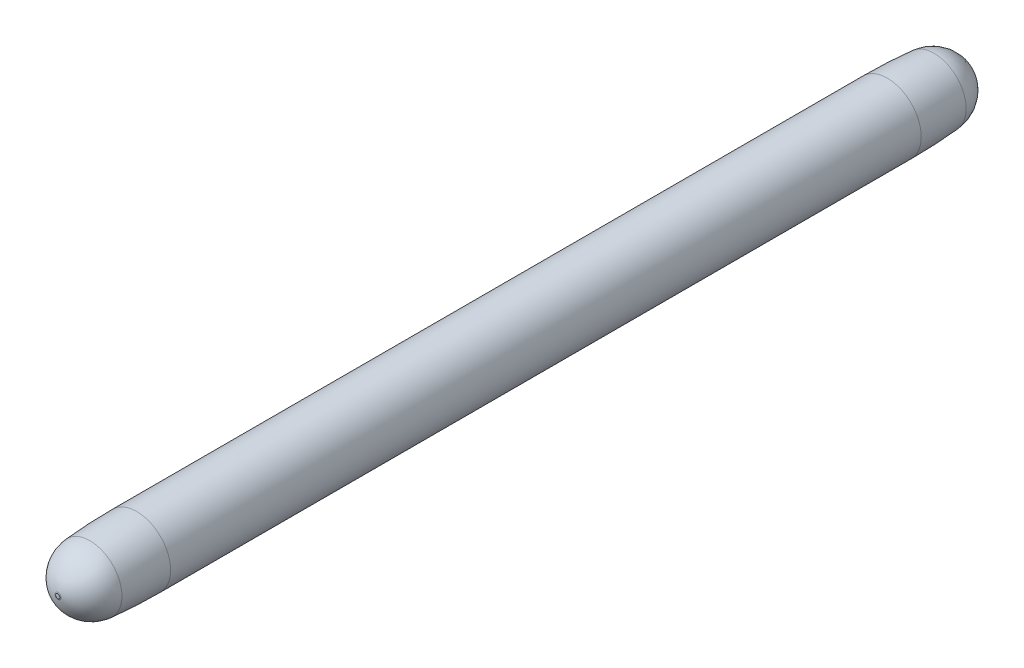
ISO-10303-21;
HEADER;
FILE_DESCRIPTION(('STEP AP214'),'2;1');
FILE_NAME('part.step','',(''),(''),'','','');
FILE_SCHEMA(('AUTOMOTIVE_DESIGN { 1 0 10303 214 1 1 1 1 }'));
ENDSEC;
DATA;
#1=APPLICATION_CONTEXT('core data for automotive mechanical design processes');
#2=APPLICATION_PROTOCOL_DEFINITION('international standard','automotive_design',2000,#1);
#3=PRODUCT_CONTEXT('',#1,'mechanical');
#4=PRODUCT('Part','Part','',(#3));
#5=PRODUCT_RELATED_PRODUCT_CATEGORY('part','',(#4));
#6=PRODUCT_DEFINITION_FORMATION('','',#4);
#7=PRODUCT_DEFINITION_CONTEXT('part definition',#1,'design');
#8=PRODUCT_DEFINITION('design','',#6,#7);
#9=PRODUCT_DEFINITION_SHAPE('','',#8);
#10=(LENGTH_UNIT() NAMED_UNIT(*) SI_UNIT(.MILLI.,.METRE.));
#11=(NAMED_UNIT(*) PLANE_ANGLE_UNIT() SI_UNIT($,.RADIAN.));
#12=(NAMED_UNIT(*) SI_UNIT($,.STERADIAN.) SOLID_ANGLE_UNIT());
#13=UNCERTAINTY_MEASURE_WITH_UNIT(LENGTH_MEASURE(1.E-05),#10,'distance_accuracy_value','');
#14=(GEOMETRIC_REPRESENTATION_CONTEXT(3) GLOBAL_UNCERTAINTY_ASSIGNED_CONTEXT((#13)) GLOBAL_UNIT_ASSIGNED_CONTEXT((#10,
#11,#12)) REPRESENTATION_CONTEXT('',''));
#15=CARTESIAN_POINT('',(0.,0.,0.));
#16=DIRECTION('',(0.,0.,1.));
#17=DIRECTION('',(1.,0.,0.));
#18=AXIS2_PLACEMENT_3D('',#15,#16,#17);
#19=CARTESIAN_POINT('',(0.,0.,-168.738635424338));
#20=DIRECTION('',(0.,0.,-1.));
#21=DIRECTION('',(-1.,0.,0.));
#22=AXIS2_PLACEMENT_3D('',#19,#20,#21);
#23=PLANE('',#22);
#24=CARTESIAN_POINT('',(0.,0.,-168.738635424338));
#25=DIRECTION('',(0.,0.,1.));
#26=DIRECTION('',(1.,0.,0.));
#27=AXIS2_PLACEMENT_3D('',#24,#25,#26);
#28=CIRCLE('',#27,9.74268371492497);
#29=CARTESIAN_POINT('',(9.74268371492497,0.,-168.738635424338));
#30=VERTEX_POINT('',#29);
#31=EDGE_CURVE('E51',#30,#30,#28,.T.);
#32=ORIENTED_EDGE('',*,*,#31,.F.);
#33=EDGE_LOOP('',(#32));
#34=FACE_BOUND('',#33,.T.);
#35=ADVANCED_FACE('F31',(#34),#23,.T.);
#36=CARTESIAN_POINT('',(0.,0.,-94.010460189252));
#37=DIRECTION('',(0.,0.,1.));
#38=DIRECTION('',(1.,0.,0.));
#39=AXIS2_PLACEMENT_3D('',#36,#37,#38);
#40=DEGENERATE_TOROIDAL_SURFACE('',#39,6.24945683811173,74.9890384305411,.F.);
#41=CARTESIAN_POINT('',(0.,0.,-166.662872637196));
#42=DIRECTION('',(0.,0.,1.));
#43=DIRECTION('',(1.,0.,0.));
#44=AXIS2_PLACEMENT_3D('',#41,#42,#43);
#45=CIRCLE('',#44,12.3242571208945);
#46=CARTESIAN_POINT('',(12.3242571208945,0.,-166.662872637196));
#47=VERTEX_POINT('',#46);
#48=EDGE_CURVE('E48',#47,#47,#45,.F.);
#49=ORIENTED_EDGE('',*,*,#48,.F.);
#50=EDGE_LOOP('',(#49));
#51=FACE_BOUND('',#50,.T.);
#52=CARTESIAN_POINT('',(0.,0.,-100.));
#53=DIRECTION('',(0.,0.,1.));
#54=DIRECTION('',(1.,0.,0.));
#55=AXIS2_PLACEMENT_3D('',#52,#53,#54);
#56=CIRCLE('',#55,68.5);
#57=CARTESIAN_POINT('',(68.5,0.,-100.));
#58=VERTEX_POINT('',#57);
#59=EDGE_CURVE('E56',#58,#58,#56,.T.);
#60=ORIENTED_EDGE('',*,*,#59,.F.);
#61=EDGE_LOOP('',(#60));
#62=FACE_BOUND('',#61,.T.);
#63=ADVANCED_FACE('F67',(#51,#62),#40,.F.);
#64=CARTESIAN_POINT('',(0.,0.,-1.94289029309402E-13));
#65=DIRECTION('',(0.,0.,1.));
#66=DIRECTION('',(1.,0.,0.));
#67=AXIS2_PLACEMENT_3D('',#64,#65,#66);
#68=DEGENERATE_TOROIDAL_SURFACE('',#67,1179.49999999999,1251.99999999999,.F.);
#69=ORIENTED_EDGE('',*,*,#59,.T.);
#70=EDGE_LOOP('',(#69));
#71=FACE_BOUND('',#70,.T.);
#72=CARTESIAN_POINT('',(0.,0.,0.));
#73=DIRECTION('',(0.,0.,1.));
#74=DIRECTION('',(1.,0.,0.));
#75=AXIS2_PLACEMENT_3D('',#72,#73,#74);
#76=CIRCLE('',#75,72.5);
#77=CARTESIAN_POINT('',(72.5,0.,0.));
#78=VERTEX_POINT('',#77);
#79=EDGE_CURVE('E35',#78,#78,#76,.T.);
#80=ORIENTED_EDGE('',*,*,#79,.F.);
#81=EDGE_LOOP('',(#80));
#82=FACE_BOUND('',#81,.T.);
#83=ADVANCED_FACE('F72',(#71,#82),#68,.F.);
#84=CARTESIAN_POINT('',(0.,0.,-170.538234368377));
#85=DIRECTION('',(0.,0.,-1.));
#86=DIRECTION('',(-1.,0.,0.));
#87=AXIS2_PLACEMENT_3D('',#84,#85,#86);
#88=TOROIDAL_SURFACE('',#87,13.315,4.);
#89=ORIENTED_EDGE('',*,*,#31,.T.);
#90=EDGE_LOOP('',(#89));
#91=FACE_BOUND('',#90,.T.);
#92=ORIENTED_EDGE('',*,*,#48,.T.);
#93=EDGE_LOOP('',(#92));
#94=FACE_BOUND('',#93,.T.);
#95=ADVANCED_FACE('F63',(#91,#94),#88,.F.);
#96=CARTESIAN_POINT('',(0.,0.,-373.799601968436));
#97=DIRECTION('',(0.,0.,1.));
#98=DIRECTION('',(1.,0.,0.));
#99=AXIS2_PLACEMENT_3D('',#96,#97,#98);
#100=CYLINDRICAL_SURFACE('',#99,72.5);
#101=CARTESIAN_POINT('',(0.,0.,1604.));
#102=DIRECTION('',(0.,0.,1.));
#103=DIRECTION('',(1.,0.,0.));
#104=AXIS2_PLACEMENT_3D('',#101,#102,#103);
#105=CIRCLE('',#104,72.5);
#106=CARTESIAN_POINT('',(72.5,0.,1604.));
#107=VERTEX_POINT('',#106);
#108=EDGE_CURVE('E52',#107,#107,#105,.T.);
#109=ORIENTED_EDGE('',*,*,#108,.F.);
#110=EDGE_LOOP('',(#109));
#111=FACE_BOUND('',#110,.T.);
#112=ORIENTED_EDGE('',*,*,#79,.T.);
#113=EDGE_LOOP('',(#112));
#114=FACE_BOUND('',#113,.T.);
#115=ADVANCED_FACE('F33',(#111,#114),#100,.T.);
#116=CARTESIAN_POINT('',(0.,0.,1604.));
#117=DIRECTION('',(0.,0.,-1.));
#118=DIRECTION('',(1.,0.,0.));
#119=AXIS2_PLACEMENT_3D('',#116,#117,#118);
#120=DEGENERATE_TOROIDAL_SURFACE('',#119,1179.49999999999,1251.99999999999,.F.);
#121=CARTESIAN_POINT('',(0.,0.,1704.));
#122=DIRECTION('',(0.,0.,1.));
#123=DIRECTION('',(1.,0.,0.));
#124=AXIS2_PLACEMENT_3D('',#121,#122,#123);
#125=CIRCLE('',#124,68.5);
#126=CARTESIAN_POINT('',(68.5,0.,1704.));
#127=VERTEX_POINT('',#126);
#128=EDGE_CURVE('E44',#127,#127,#125,.T.);
#129=ORIENTED_EDGE('',*,*,#128,.F.);
#130=EDGE_LOOP('',(#129));
#131=FACE_BOUND('',#130,.T.);
#132=ORIENTED_EDGE('',*,*,#108,.T.);
#133=EDGE_LOOP('',(#132));
#134=FACE_BOUND('',#133,.T.);
#135=ADVANCED_FACE('F90',(#131,#134),#120,.F.);
#136=CARTESIAN_POINT('',(0.,0.,1698.01046018925));
#137=DIRECTION('',(0.,0.,-1.));
#138=DIRECTION('',(1.,0.,0.));
#139=AXIS2_PLACEMENT_3D('',#136,#137,#138);
#140=DEGENERATE_TOROIDAL_SURFACE('',#139,6.24945683811173,74.9890384305411,.F.);
#141=CARTESIAN_POINT('',(0.,0.,1771.90856540861));
#142=DIRECTION('',(0.,0.,-1.));
#143=DIRECTION('',(-1.,0.,0.));
#144=AXIS2_PLACEMENT_3D('',#141,#142,#143);
#145=CIRCLE('',#144,6.49518633953032);
#146=CARTESIAN_POINT('',(-6.49518633953032,0.,1771.90856540861));
#147=VERTEX_POINT('',#146);
#148=EDGE_CURVE('E10',#147,#147,#145,.F.);
#149=ORIENTED_EDGE('',*,*,#148,.F.);
#150=EDGE_LOOP('',(#149));
#151=FACE_BOUND('',#150,.T.);
#152=ORIENTED_EDGE('',*,*,#128,.T.);
#153=EDGE_LOOP('',(#152));
#154=FACE_BOUND('',#153,.T.);
#155=ADVANCED_FACE('F83',(#151,#154),#140,.F.);
#156=CARTESIAN_POINT('',(0.,0.,1775.85037379907));
#157=DIRECTION('',(0.,0.,1.));
#158=DIRECTION('',(1.,0.,0.));
#159=AXIS2_PLACEMENT_3D('',#156,#157,#158);
#160=TOROIDAL_SURFACE('',#159,7.175,4.);
#161=CARTESIAN_POINT('',(0.,0.,1772.73863542434));
#162=DIRECTION('',(0.,0.,-1.));
#163=DIRECTION('',(-1.,0.,0.));
#164=AXIS2_PLACEMENT_3D('',#161,#162,#163);
#165=CIRCLE('',#164,4.66161895303386);
#166=CARTESIAN_POINT('',(-4.66161895303386,0.,1772.73863542434));
#167=VERTEX_POINT('',#166);
#168=EDGE_CURVE('E39',#167,#167,#165,.T.);
#169=ORIENTED_EDGE('',*,*,#168,.T.);
#170=EDGE_LOOP('',(#169));
#171=FACE_BOUND('',#170,.T.);
#172=ORIENTED_EDGE('',*,*,#148,.T.);
#173=EDGE_LOOP('',(#172));
#174=FACE_BOUND('',#173,.T.);
#175=ADVANCED_FACE('F78',(#171,#174),#160,.F.);
#176=CARTESIAN_POINT('',(0.,0.,1772.73863542434));
#177=DIRECTION('',(0.,0.,1.));
#178=DIRECTION('',(1.,0.,0.));
#179=AXIS2_PLACEMENT_3D('',#176,#177,#178);
#180=PLANE('',#179);
#181=ORIENTED_EDGE('',*,*,#168,.F.);
#182=EDGE_LOOP('',(#181));
#183=FACE_BOUND('',#182,.T.);
#184=ADVANCED_FACE('F76',(#183),#180,.T.);
#185=CLOSED_SHELL('',(#35,#63,#83,#95,#115,#135,#155,#175,#184));
#186=MANIFOLD_SOLID_BREP('B2',#185);
#187=ADVANCED_BREP_SHAPE_REPRESENTATION('',(#18,#186),#14);
#188=SHAPE_DEFINITION_REPRESENTATION(#9,#187);
ENDSEC;
END-ISO-10303-21;
